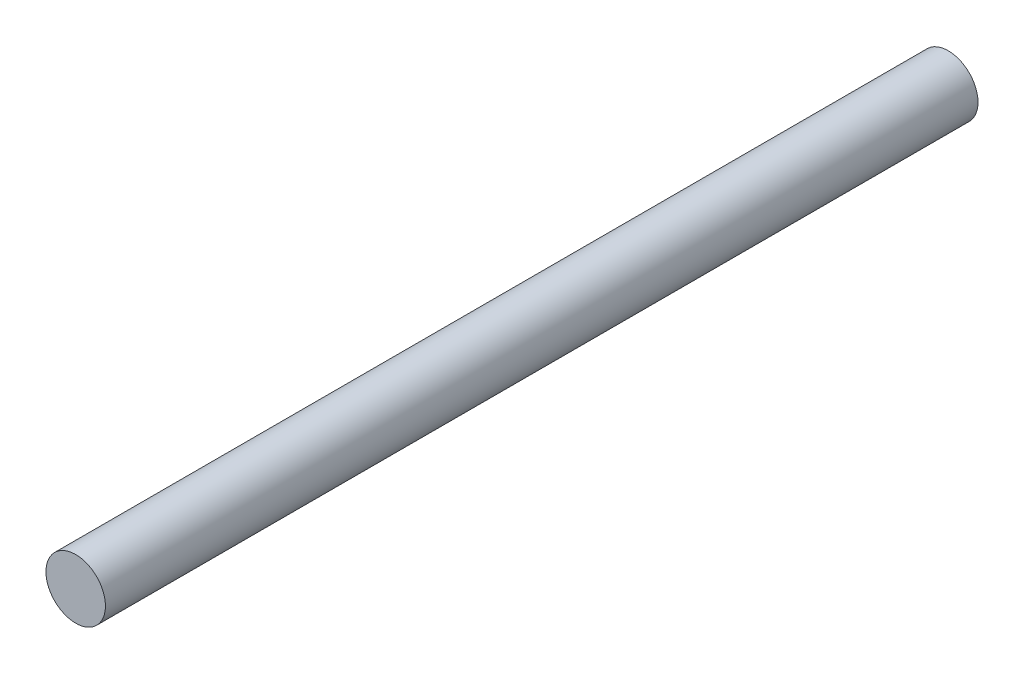
ISO-10303-21;
HEADER;
FILE_DESCRIPTION(('STEP AP214'),'2;1');
FILE_NAME('part.step','',(''),(''),'','','');
FILE_SCHEMA(('AUTOMOTIVE_DESIGN { 1 0 10303 214 1 1 1 1 }'));
ENDSEC;
DATA;
#1=APPLICATION_CONTEXT('core data for automotive mechanical design processes');
#2=APPLICATION_PROTOCOL_DEFINITION('international standard','automotive_design',2000,#1);
#3=PRODUCT_CONTEXT('',#1,'mechanical');
#4=PRODUCT('Part','Part','',(#3));
#5=PRODUCT_RELATED_PRODUCT_CATEGORY('part','',(#4));
#6=PRODUCT_DEFINITION_FORMATION('','',#4);
#7=PRODUCT_DEFINITION_CONTEXT('part definition',#1,'design');
#8=PRODUCT_DEFINITION('design','',#6,#7);
#9=PRODUCT_DEFINITION_SHAPE('','',#8);
#10=(LENGTH_UNIT() NAMED_UNIT(*) SI_UNIT(.MILLI.,.METRE.));
#11=(NAMED_UNIT(*) PLANE_ANGLE_UNIT() SI_UNIT($,.RADIAN.));
#12=(NAMED_UNIT(*) SI_UNIT($,.STERADIAN.) SOLID_ANGLE_UNIT());
#13=UNCERTAINTY_MEASURE_WITH_UNIT(LENGTH_MEASURE(1.E-05),#10,'distance_accuracy_value','');
#14=(GEOMETRIC_REPRESENTATION_CONTEXT(3) GLOBAL_UNCERTAINTY_ASSIGNED_CONTEXT((#13)) GLOBAL_UNIT_ASSIGNED_CONTEXT((#10,
#11,#12)) REPRESENTATION_CONTEXT('',''));
#15=CARTESIAN_POINT('',(0.,0.,0.));
#16=DIRECTION('',(0.,0.,1.));
#17=DIRECTION('',(1.,0.,0.));
#18=AXIS2_PLACEMENT_3D('',#15,#16,#17);
#19=CARTESIAN_POINT('',(0.,0.,22.));
#20=DIRECTION('',(0.,0.,-1.));
#21=DIRECTION('',(-1.,0.,0.));
#22=AXIS2_PLACEMENT_3D('',#19,#20,#21);
#23=CYLINDRICAL_SURFACE('',#22,1.5);
#24=CARTESIAN_POINT('',(0.,0.,22.));
#25=DIRECTION('',(0.,0.,1.));
#26=DIRECTION('',(1.,0.,0.));
#27=AXIS2_PLACEMENT_3D('',#24,#25,#26);
#28=CIRCLE('',#27,1.5);
#29=CARTESIAN_POINT('',(1.5,0.,22.));
#30=VERTEX_POINT('',#29);
#31=EDGE_CURVE('E10',#30,#30,#28,.T.);
#32=ORIENTED_EDGE('',*,*,#31,.F.);
#33=EDGE_LOOP('',(#32));
#34=FACE_BOUND('',#33,.T.);
#35=CARTESIAN_POINT('',(0.,0.,-22.));
#36=DIRECTION('',(0.,0.,1.));
#37=DIRECTION('',(1.,0.,0.));
#38=AXIS2_PLACEMENT_3D('',#35,#36,#37);
#39=CIRCLE('',#38,1.5);
#40=CARTESIAN_POINT('',(1.5,0.,-22.));
#41=VERTEX_POINT('',#40);
#42=EDGE_CURVE('E34',#41,#41,#39,.T.);
#43=ORIENTED_EDGE('',*,*,#42,.T.);
#44=EDGE_LOOP('',(#43));
#45=FACE_BOUND('',#44,.T.);
#46=ADVANCED_FACE('F31',(#34,#45),#23,.T.);
#47=CARTESIAN_POINT('',(0.,0.,22.));
#48=DIRECTION('',(0.,0.,1.));
#49=DIRECTION('',(1.,0.,0.));
#50=AXIS2_PLACEMENT_3D('',#47,#48,#49);
#51=PLANE('',#50);
#52=ORIENTED_EDGE('',*,*,#31,.T.);
#53=EDGE_LOOP('',(#52));
#54=FACE_BOUND('',#53,.T.);
#55=ADVANCED_FACE('F46',(#54),#51,.T.);
#56=CARTESIAN_POINT('',(0.,0.,-22.));
#57=DIRECTION('',(0.,0.,1.));
#58=DIRECTION('',(1.,0.,0.));
#59=AXIS2_PLACEMENT_3D('',#56,#57,#58);
#60=PLANE('',#59);
#61=ORIENTED_EDGE('',*,*,#42,.F.);
#62=EDGE_LOOP('',(#61));
#63=FACE_BOUND('',#62,.T.);
#64=ADVANCED_FACE('F44',(#63),#60,.F.);
#65=CLOSED_SHELL('',(#46,#55,#64));
#66=MANIFOLD_SOLID_BREP('B2',#65);
#67=ADVANCED_BREP_SHAPE_REPRESENTATION('',(#18,#66),#14);
#68=SHAPE_DEFINITION_REPRESENTATION(#9,#67);
ENDSEC;
END-ISO-10303-21;
